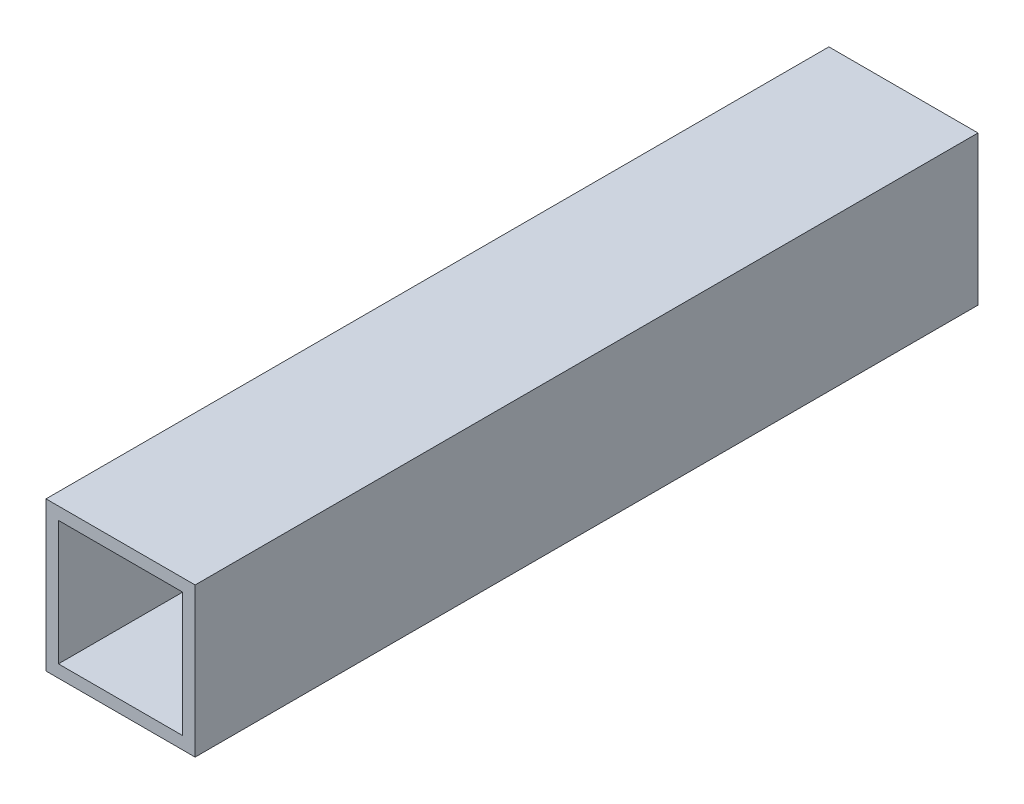
ISO-10303-21;
HEADER;
FILE_DESCRIPTION(('STEP AP214'),'2;1');
FILE_NAME('part.step','',(''),(''),'','','');
FILE_SCHEMA(('AUTOMOTIVE_DESIGN { 1 0 10303 214 1 1 1 1 }'));
ENDSEC;
DATA;
#1=APPLICATION_CONTEXT('core data for automotive mechanical design processes');
#2=APPLICATION_PROTOCOL_DEFINITION('international standard','automotive_design',2000,#1);
#3=PRODUCT_CONTEXT('',#1,'mechanical');
#4=PRODUCT('Part','Part','',(#3));
#5=PRODUCT_RELATED_PRODUCT_CATEGORY('part','',(#4));
#6=PRODUCT_DEFINITION_FORMATION('','',#4);
#7=PRODUCT_DEFINITION_CONTEXT('part definition',#1,'design');
#8=PRODUCT_DEFINITION('design','',#6,#7);
#9=PRODUCT_DEFINITION_SHAPE('','',#8);
#10=(LENGTH_UNIT() NAMED_UNIT(*) SI_UNIT(.MILLI.,.METRE.));
#11=(NAMED_UNIT(*) PLANE_ANGLE_UNIT() SI_UNIT($,.RADIAN.));
#12=(NAMED_UNIT(*) SI_UNIT($,.STERADIAN.) SOLID_ANGLE_UNIT());
#13=UNCERTAINTY_MEASURE_WITH_UNIT(LENGTH_MEASURE(1.E-05),#10,'distance_accuracy_value','');
#14=(GEOMETRIC_REPRESENTATION_CONTEXT(3) GLOBAL_UNCERTAINTY_ASSIGNED_CONTEXT((#13)) GLOBAL_UNIT_ASSIGNED_CONTEXT((#10,
#11,#12)) REPRESENTATION_CONTEXT('',''));
#15=CARTESIAN_POINT('',(0.,0.,0.));
#16=DIRECTION('',(0.,0.,1.));
#17=DIRECTION('',(1.,0.,0.));
#18=AXIS2_PLACEMENT_3D('',#15,#16,#17);
#19=CARTESIAN_POINT('',(0.,0.,126.));
#20=DIRECTION('',(0.,0.,1.));
#21=DIRECTION('',(1.,0.,0.));
#22=AXIS2_PLACEMENT_3D('',#19,#20,#21);
#23=PLANE('',#22);
#24=DIRECTION('',(0.,-1.,0.));
#25=VECTOR('',#24,1.);
#26=CARTESIAN_POINT('',(-12.,12.,126.));
#27=LINE('',#26,#25);
#28=CARTESIAN_POINT('',(-12.,12.,126.));
#29=VERTEX_POINT('',#28);
#30=CARTESIAN_POINT('',(-12.,-12.,126.));
#31=VERTEX_POINT('',#30);
#32=EDGE_CURVE('E136',#29,#31,#27,.T.);
#33=ORIENTED_EDGE('',*,*,#32,.T.);
#34=DIRECTION('',(1.,0.,0.));
#35=VECTOR('',#34,1.);
#36=CARTESIAN_POINT('',(-12.,-12.,126.));
#37=LINE('',#36,#35);
#38=CARTESIAN_POINT('',(12.,-12.,126.));
#39=VERTEX_POINT('',#38);
#40=EDGE_CURVE('E139',#31,#39,#37,.T.);
#41=ORIENTED_EDGE('',*,*,#40,.T.);
#42=DIRECTION('',(0.,1.,0.));
#43=VECTOR('',#42,1.);
#44=CARTESIAN_POINT('',(12.,12.,126.));
#45=LINE('',#44,#43);
#46=CARTESIAN_POINT('',(12.,12.,126.));
#47=VERTEX_POINT('',#46);
#48=EDGE_CURVE('E142',#39,#47,#45,.T.);
#49=ORIENTED_EDGE('',*,*,#48,.T.);
#50=DIRECTION('',(-1.,0.,0.));
#51=VECTOR('',#50,1.);
#52=CARTESIAN_POINT('',(-12.,12.,126.));
#53=LINE('',#52,#51);
#54=EDGE_CURVE('E144',#47,#29,#53,.T.);
#55=ORIENTED_EDGE('',*,*,#54,.T.);
#56=EDGE_LOOP('',(#33,#41,#49,#55));
#57=FACE_BOUND('',#56,.T.);
#58=DIRECTION('',(-1.,0.,0.));
#59=VECTOR('',#58,1.);
#60=CARTESIAN_POINT('',(-10.,10.,126.));
#61=LINE('',#60,#59);
#62=CARTESIAN_POINT('',(10.,10.,126.));
#63=VERTEX_POINT('',#62);
#64=CARTESIAN_POINT('',(-10.,10.,126.));
#65=VERTEX_POINT('',#64);
#66=EDGE_CURVE('E108',#63,#65,#61,.T.);
#67=ORIENTED_EDGE('',*,*,#66,.F.);
#68=DIRECTION('',(0.,1.,0.));
#69=VECTOR('',#68,1.);
#70=CARTESIAN_POINT('',(10.,10.,126.));
#71=LINE('',#70,#69);
#72=CARTESIAN_POINT('',(10.,-10.,126.));
#73=VERTEX_POINT('',#72);
#74=EDGE_CURVE('E100',#73,#63,#71,.T.);
#75=ORIENTED_EDGE('',*,*,#74,.F.);
#76=DIRECTION('',(1.,0.,0.));
#77=VECTOR('',#76,1.);
#78=CARTESIAN_POINT('',(-10.,-10.,126.));
#79=LINE('',#78,#77);
#80=CARTESIAN_POINT('',(-10.,-10.,126.));
#81=VERTEX_POINT('',#80);
#82=EDGE_CURVE('E122',#81,#73,#79,.T.);
#83=ORIENTED_EDGE('',*,*,#82,.F.);
#84=DIRECTION('',(0.,-1.,0.));
#85=VECTOR('',#84,1.);
#86=CARTESIAN_POINT('',(-10.,10.,126.));
#87=LINE('',#86,#85);
#88=EDGE_CURVE('E120',#65,#81,#87,.T.);
#89=ORIENTED_EDGE('',*,*,#88,.F.);
#90=EDGE_LOOP('',(#67,#75,#83,#89));
#91=FACE_BOUND('',#90,.T.);
#92=ADVANCED_FACE('F35',(#57,#91),#23,.T.);
#93=CARTESIAN_POINT('',(0.,0.,0.));
#94=DIRECTION('',(0.,0.,1.));
#95=DIRECTION('',(1.,0.,0.));
#96=AXIS2_PLACEMENT_3D('',#93,#94,#95);
#97=PLANE('',#96);
#98=DIRECTION('',(0.,-1.,0.));
#99=VECTOR('',#98,1.);
#100=CARTESIAN_POINT('',(-12.,12.,0.));
#101=LINE('',#100,#99);
#102=CARTESIAN_POINT('',(-12.,12.,0.));
#103=VERTEX_POINT('',#102);
#104=CARTESIAN_POINT('',(-12.,-12.,0.));
#105=VERTEX_POINT('',#104);
#106=EDGE_CURVE('E116',#103,#105,#101,.T.);
#107=ORIENTED_EDGE('',*,*,#106,.F.);
#108=DIRECTION('',(-1.,0.,0.));
#109=VECTOR('',#108,1.);
#110=CARTESIAN_POINT('',(-12.,12.,0.));
#111=LINE('',#110,#109);
#112=CARTESIAN_POINT('',(12.,12.,0.));
#113=VERTEX_POINT('',#112);
#114=EDGE_CURVE('E140',#113,#103,#111,.T.);
#115=ORIENTED_EDGE('',*,*,#114,.F.);
#116=DIRECTION('',(0.,1.,0.));
#117=VECTOR('',#116,1.);
#118=CARTESIAN_POINT('',(12.,12.,0.));
#119=LINE('',#118,#117);
#120=CARTESIAN_POINT('',(12.,-12.,0.));
#121=VERTEX_POINT('',#120);
#122=EDGE_CURVE('E151',#121,#113,#119,.T.);
#123=ORIENTED_EDGE('',*,*,#122,.F.);
#124=DIRECTION('',(1.,0.,0.));
#125=VECTOR('',#124,1.);
#126=CARTESIAN_POINT('',(-12.,-12.,0.));
#127=LINE('',#126,#125);
#128=EDGE_CURVE('E149',#105,#121,#127,.T.);
#129=ORIENTED_EDGE('',*,*,#128,.F.);
#130=EDGE_LOOP('',(#107,#115,#123,#129));
#131=FACE_BOUND('',#130,.T.);
#132=DIRECTION('',(0.,1.,0.));
#133=VECTOR('',#132,1.);
#134=CARTESIAN_POINT('',(10.,10.,0.));
#135=LINE('',#134,#133);
#136=CARTESIAN_POINT('',(10.,-10.,0.));
#137=VERTEX_POINT('',#136);
#138=CARTESIAN_POINT('',(10.,10.,0.));
#139=VERTEX_POINT('',#138);
#140=EDGE_CURVE('E58',#137,#139,#135,.T.);
#141=ORIENTED_EDGE('',*,*,#140,.T.);
#142=DIRECTION('',(-1.,0.,0.));
#143=VECTOR('',#142,1.);
#144=CARTESIAN_POINT('',(-10.,10.,0.));
#145=LINE('',#144,#143);
#146=CARTESIAN_POINT('',(-10.,10.,0.));
#147=VERTEX_POINT('',#146);
#148=EDGE_CURVE('E115',#139,#147,#145,.T.);
#149=ORIENTED_EDGE('',*,*,#148,.T.);
#150=DIRECTION('',(0.,-1.,0.));
#151=VECTOR('',#150,1.);
#152=CARTESIAN_POINT('',(-10.,10.,0.));
#153=LINE('',#152,#151);
#154=CARTESIAN_POINT('',(-10.,-10.,0.));
#155=VERTEX_POINT('',#154);
#156=EDGE_CURVE('E128',#147,#155,#153,.T.);
#157=ORIENTED_EDGE('',*,*,#156,.T.);
#158=DIRECTION('',(1.,0.,0.));
#159=VECTOR('',#158,1.);
#160=CARTESIAN_POINT('',(-10.,-10.,0.));
#161=LINE('',#160,#159);
#162=EDGE_CURVE('E109',#155,#137,#161,.T.);
#163=ORIENTED_EDGE('',*,*,#162,.T.);
#164=EDGE_LOOP('',(#141,#149,#157,#163));
#165=FACE_BOUND('',#164,.T.);
#166=ADVANCED_FACE('F169',(#131,#165),#97,.F.);
#167=CARTESIAN_POINT('',(-12.,12.,126.));
#168=DIRECTION('',(1.,0.,0.));
#169=DIRECTION('',(0.,1.,0.));
#170=AXIS2_PLACEMENT_3D('',#167,#168,#169);
#171=PLANE('',#170);
#172=ORIENTED_EDGE('',*,*,#106,.T.);
#173=DIRECTION('',(0.,0.,-1.));
#174=VECTOR('',#173,1.);
#175=CARTESIAN_POINT('',(-12.,-12.,126.));
#176=LINE('',#175,#174);
#177=EDGE_CURVE('E11',#31,#105,#176,.T.);
#178=ORIENTED_EDGE('',*,*,#177,.F.);
#179=ORIENTED_EDGE('',*,*,#32,.F.);
#180=DIRECTION('',(0.,0.,-1.));
#181=VECTOR('',#180,1.);
#182=CARTESIAN_POINT('',(-12.,12.,126.));
#183=LINE('',#182,#181);
#184=EDGE_CURVE('E146',#29,#103,#183,.T.);
#185=ORIENTED_EDGE('',*,*,#184,.T.);
#186=EDGE_LOOP('',(#172,#178,#179,#185));
#187=FACE_BOUND('',#186,.T.);
#188=ADVANCED_FACE('F37',(#187),#171,.F.);
#189=CARTESIAN_POINT('',(-12.,-12.,126.));
#190=DIRECTION('',(0.,1.,0.));
#191=DIRECTION('',(-1.,0.,0.));
#192=AXIS2_PLACEMENT_3D('',#189,#190,#191);
#193=PLANE('',#192);
#194=ORIENTED_EDGE('',*,*,#128,.T.);
#195=DIRECTION('',(0.,0.,-1.));
#196=VECTOR('',#195,1.);
#197=CARTESIAN_POINT('',(12.,-12.,126.));
#198=LINE('',#197,#196);
#199=EDGE_CURVE('E43',#39,#121,#198,.T.);
#200=ORIENTED_EDGE('',*,*,#199,.F.);
#201=ORIENTED_EDGE('',*,*,#40,.F.);
#202=ORIENTED_EDGE('',*,*,#177,.T.);
#203=EDGE_LOOP('',(#194,#200,#201,#202));
#204=FACE_BOUND('',#203,.T.);
#205=ADVANCED_FACE('F179',(#204),#193,.F.);
#206=CARTESIAN_POINT('',(12.,12.,126.));
#207=DIRECTION('',(-1.,0.,0.));
#208=DIRECTION('',(0.,-1.,0.));
#209=AXIS2_PLACEMENT_3D('',#206,#207,#208);
#210=PLANE('',#209);
#211=ORIENTED_EDGE('',*,*,#122,.T.);
#212=DIRECTION('',(0.,0.,-1.));
#213=VECTOR('',#212,1.);
#214=CARTESIAN_POINT('',(12.,12.,126.));
#215=LINE('',#214,#213);
#216=EDGE_CURVE('E156',#47,#113,#215,.T.);
#217=ORIENTED_EDGE('',*,*,#216,.F.);
#218=ORIENTED_EDGE('',*,*,#48,.F.);
#219=ORIENTED_EDGE('',*,*,#199,.T.);
#220=EDGE_LOOP('',(#211,#217,#218,#219));
#221=FACE_BOUND('',#220,.T.);
#222=ADVANCED_FACE('F163',(#221),#210,.F.);
#223=CARTESIAN_POINT('',(-12.,12.,126.));
#224=DIRECTION('',(0.,-1.,0.));
#225=DIRECTION('',(0.,0.,-1.));
#226=AXIS2_PLACEMENT_3D('',#223,#224,#225);
#227=PLANE('',#226);
#228=ORIENTED_EDGE('',*,*,#114,.T.);
#229=ORIENTED_EDGE('',*,*,#184,.F.);
#230=ORIENTED_EDGE('',*,*,#54,.F.);
#231=ORIENTED_EDGE('',*,*,#216,.T.);
#232=EDGE_LOOP('',(#228,#229,#230,#231));
#233=FACE_BOUND('',#232,.T.);
#234=ADVANCED_FACE('F173',(#233),#227,.F.);
#235=CARTESIAN_POINT('',(10.,10.,126.));
#236=DIRECTION('',(-1.,0.,0.));
#237=DIRECTION('',(0.,0.,1.));
#238=AXIS2_PLACEMENT_3D('',#235,#236,#237);
#239=PLANE('',#238);
#240=ORIENTED_EDGE('',*,*,#140,.F.);
#241=DIRECTION('',(0.,0.,-1.));
#242=VECTOR('',#241,1.);
#243=CARTESIAN_POINT('',(10.,-10.,126.));
#244=LINE('',#243,#242);
#245=EDGE_CURVE('E104',#73,#137,#244,.T.);
#246=ORIENTED_EDGE('',*,*,#245,.F.);
#247=ORIENTED_EDGE('',*,*,#74,.T.);
#248=DIRECTION('',(0.,0.,-1.));
#249=VECTOR('',#248,1.);
#250=CARTESIAN_POINT('',(10.,10.,126.));
#251=LINE('',#250,#249);
#252=EDGE_CURVE('E103',#63,#139,#251,.T.);
#253=ORIENTED_EDGE('',*,*,#252,.T.);
#254=EDGE_LOOP('',(#240,#246,#247,#253));
#255=FACE_BOUND('',#254,.T.);
#256=ADVANCED_FACE('F102',(#255),#239,.T.);
#257=CARTESIAN_POINT('',(-10.,10.,126.));
#258=DIRECTION('',(0.,-1.,0.));
#259=DIRECTION('',(0.,0.,-1.));
#260=AXIS2_PLACEMENT_3D('',#257,#258,#259);
#261=PLANE('',#260);
#262=ORIENTED_EDGE('',*,*,#148,.F.);
#263=ORIENTED_EDGE('',*,*,#252,.F.);
#264=ORIENTED_EDGE('',*,*,#66,.T.);
#265=DIRECTION('',(0.,0.,-1.));
#266=VECTOR('',#265,1.);
#267=CARTESIAN_POINT('',(-10.,10.,126.));
#268=LINE('',#267,#266);
#269=EDGE_CURVE('E117',#65,#147,#268,.T.);
#270=ORIENTED_EDGE('',*,*,#269,.T.);
#271=EDGE_LOOP('',(#262,#263,#264,#270));
#272=FACE_BOUND('',#271,.T.);
#273=ADVANCED_FACE('F112',(#272),#261,.T.);
#274=CARTESIAN_POINT('',(-10.,10.,126.));
#275=DIRECTION('',(1.,0.,0.));
#276=DIRECTION('',(0.,1.,0.));
#277=AXIS2_PLACEMENT_3D('',#274,#275,#276);
#278=PLANE('',#277);
#279=ORIENTED_EDGE('',*,*,#156,.F.);
#280=ORIENTED_EDGE('',*,*,#269,.F.);
#281=ORIENTED_EDGE('',*,*,#88,.T.);
#282=DIRECTION('',(0.,0.,-1.));
#283=VECTOR('',#282,1.);
#284=CARTESIAN_POINT('',(-10.,-10.,126.));
#285=LINE('',#284,#283);
#286=EDGE_CURVE('E50',#81,#155,#285,.T.);
#287=ORIENTED_EDGE('',*,*,#286,.T.);
#288=EDGE_LOOP('',(#279,#280,#281,#287));
#289=FACE_BOUND('',#288,.T.);
#290=ADVANCED_FACE('F202',(#289),#278,.T.);
#291=CARTESIAN_POINT('',(-10.,-10.,126.));
#292=DIRECTION('',(0.,1.,0.));
#293=DIRECTION('',(0.,0.,1.));
#294=AXIS2_PLACEMENT_3D('',#291,#292,#293);
#295=PLANE('',#294);
#296=ORIENTED_EDGE('',*,*,#162,.F.);
#297=ORIENTED_EDGE('',*,*,#286,.F.);
#298=ORIENTED_EDGE('',*,*,#82,.T.);
#299=ORIENTED_EDGE('',*,*,#245,.T.);
#300=EDGE_LOOP('',(#296,#297,#298,#299));
#301=FACE_BOUND('',#300,.T.);
#302=ADVANCED_FACE('F206',(#301),#295,.T.);
#303=CLOSED_SHELL('',(#92,#166,#188,#205,#222,#234,#256,#273,#290,#302));
#304=MANIFOLD_SOLID_BREP('B2',#303);
#305=ADVANCED_BREP_SHAPE_REPRESENTATION('',(#18,#304),#14);
#306=SHAPE_DEFINITION_REPRESENTATION(#9,#305);
ENDSEC;
END-ISO-10303-21;
